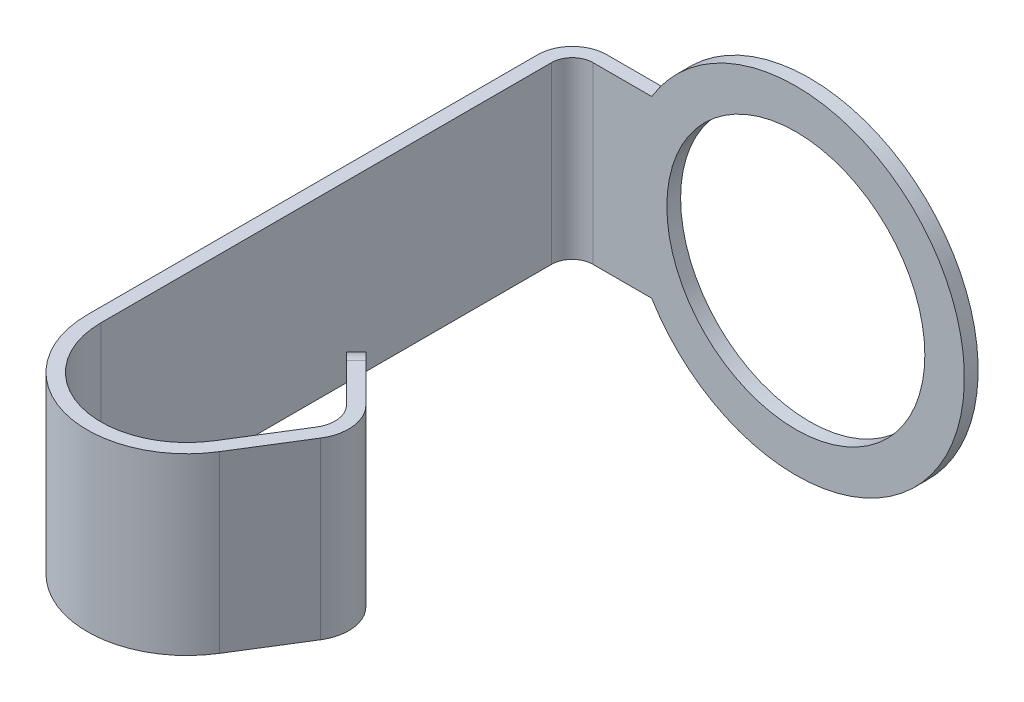
ISO-10303-21;
HEADER;
FILE_DESCRIPTION(('STEP AP214'),'2;1');
FILE_NAME('part.step','',(''),(''),'','','');
FILE_SCHEMA(('AUTOMOTIVE_DESIGN { 1 0 10303 214 1 1 1 1 }'));
ENDSEC;
DATA;
#1=APPLICATION_CONTEXT('core data for automotive mechanical design processes');
#2=APPLICATION_PROTOCOL_DEFINITION('international standard','automotive_design',2000,#1);
#3=PRODUCT_CONTEXT('',#1,'mechanical');
#4=PRODUCT('Part','Part','',(#3));
#5=PRODUCT_RELATED_PRODUCT_CATEGORY('part','',(#4));
#6=PRODUCT_DEFINITION_FORMATION('','',#4);
#7=PRODUCT_DEFINITION_CONTEXT('part definition',#1,'design');
#8=PRODUCT_DEFINITION('design','',#6,#7);
#9=PRODUCT_DEFINITION_SHAPE('','',#8);
#10=(LENGTH_UNIT() NAMED_UNIT(*) SI_UNIT(.MILLI.,.METRE.));
#11=(NAMED_UNIT(*) PLANE_ANGLE_UNIT() SI_UNIT($,.RADIAN.));
#12=(NAMED_UNIT(*) SI_UNIT($,.STERADIAN.) SOLID_ANGLE_UNIT());
#13=UNCERTAINTY_MEASURE_WITH_UNIT(LENGTH_MEASURE(1.E-05),#10,'distance_accuracy_value','');
#14=(GEOMETRIC_REPRESENTATION_CONTEXT(3) GLOBAL_UNCERTAINTY_ASSIGNED_CONTEXT((#13)) GLOBAL_UNIT_ASSIGNED_CONTEXT((#10,
#11,#12)) REPRESENTATION_CONTEXT('',''));
#15=CARTESIAN_POINT('',(0.,0.,0.));
#16=DIRECTION('',(0.,0.,1.));
#17=DIRECTION('',(1.,0.,0.));
#18=AXIS2_PLACEMENT_3D('',#15,#16,#17);
#19=CARTESIAN_POINT('',(0.,0.,0.508));
#20=DIRECTION('',(0.,0.,1.));
#21=DIRECTION('',(1.,0.,0.));
#22=AXIS2_PLACEMENT_3D('',#19,#20,#21);
#23=PLANE('',#22);
#24=CARTESIAN_POINT('',(0.,0.,0.508));
#25=DIRECTION('',(0.,0.,1.));
#26=DIRECTION('',(1.,0.,0.));
#27=AXIS2_PLACEMENT_3D('',#24,#25,#26);
#28=CIRCLE('',#27,6.223);
#29=CARTESIAN_POINT('',(-5.32164855660349,-3.2258,0.508));
#30=VERTEX_POINT('',#29);
#31=CARTESIAN_POINT('',(-5.32164855660349,3.2258,0.508));
#32=VERTEX_POINT('',#31);
#33=EDGE_CURVE('E286',#30,#32,#28,.T.);
#34=ORIENTED_EDGE('',*,*,#33,.T.);
#35=DIRECTION('',(1.,0.,0.));
#36=VECTOR('',#35,1.);
#37=CARTESIAN_POINT('',(-6.223,3.2258,0.508));
#38=LINE('',#37,#36);
#39=CARTESIAN_POINT('',(-7.49299999999999,3.2258,0.508));
#40=VERTEX_POINT('',#39);
#41=EDGE_CURVE('E170',#40,#32,#38,.T.);
#42=ORIENTED_EDGE('',*,*,#41,.F.);
#43=DIRECTION('',(0.,-1.,0.));
#44=VECTOR('',#43,1.);
#45=CARTESIAN_POINT('',(-7.49299999999999,3.2258,0.508));
#46=LINE('',#45,#44);
#47=CARTESIAN_POINT('',(-7.49299999999999,-3.2258,0.508));
#48=VERTEX_POINT('',#47);
#49=EDGE_CURVE('E242',#40,#48,#46,.T.);
#50=ORIENTED_EDGE('',*,*,#49,.T.);
#51=DIRECTION('',(-1.,0.,0.));
#52=VECTOR('',#51,1.);
#53=CARTESIAN_POINT('',(-5.32164855660349,-3.2258,0.508));
#54=LINE('',#53,#52);
#55=EDGE_CURVE('E272',#30,#48,#54,.T.);
#56=ORIENTED_EDGE('',*,*,#55,.F.);
#57=EDGE_LOOP('',(#34,#42,#50,#56));
#58=FACE_BOUND('',#57,.T.);
#59=CARTESIAN_POINT('',(0.,0.,0.508));
#60=DIRECTION('',(0.,0.,1.));
#61=DIRECTION('',(1.,0.,0.));
#62=AXIS2_PLACEMENT_3D('',#59,#60,#61);
#63=CIRCLE('',#62,4.7625);
#64=CARTESIAN_POINT('',(4.7625,0.,0.508));
#65=VERTEX_POINT('',#64);
#66=EDGE_CURVE('E281',#65,#65,#63,.T.);
#67=ORIENTED_EDGE('',*,*,#66,.F.);
#68=EDGE_LOOP('',(#67));
#69=FACE_BOUND('',#68,.T.);
#70=ADVANCED_FACE('F33',(#58,#69),#23,.T.);
#71=CARTESIAN_POINT('',(0.,0.,0.));
#72=DIRECTION('',(0.,0.,1.));
#73=DIRECTION('',(1.,0.,0.));
#74=AXIS2_PLACEMENT_3D('',#71,#72,#73);
#75=PLANE('',#74);
#76=CARTESIAN_POINT('',(0.,0.,0.));
#77=DIRECTION('',(0.,0.,1.));
#78=DIRECTION('',(1.,0.,0.));
#79=AXIS2_PLACEMENT_3D('',#76,#77,#78);
#80=CIRCLE('',#79,6.223);
#81=CARTESIAN_POINT('',(-5.32164855660349,-3.2258,0.));
#82=VERTEX_POINT('',#81);
#83=CARTESIAN_POINT('',(-5.32164855660349,3.2258,0.));
#84=VERTEX_POINT('',#83);
#85=EDGE_CURVE('E166',#82,#84,#80,.T.);
#86=ORIENTED_EDGE('',*,*,#85,.F.);
#87=DIRECTION('',(-1.,0.,0.));
#88=VECTOR('',#87,1.);
#89=CARTESIAN_POINT('',(-5.32164855660349,-3.2258,0.));
#90=LINE('',#89,#88);
#91=CARTESIAN_POINT('',(-7.49299999999999,-3.2258,0.));
#92=VERTEX_POINT('',#91);
#93=EDGE_CURVE('E159',#82,#92,#90,.T.);
#94=ORIENTED_EDGE('',*,*,#93,.T.);
#95=DIRECTION('',(0.,-1.,0.));
#96=VECTOR('',#95,1.);
#97=CARTESIAN_POINT('',(-7.49299999999999,3.2258,0.));
#98=LINE('',#97,#96);
#99=CARTESIAN_POINT('',(-7.49299999999999,3.2258,0.));
#100=VERTEX_POINT('',#99);
#101=EDGE_CURVE('E164',#100,#92,#98,.T.);
#102=ORIENTED_EDGE('',*,*,#101,.F.);
#103=DIRECTION('',(1.,0.,0.));
#104=VECTOR('',#103,1.);
#105=CARTESIAN_POINT('',(-6.223,3.2258,0.));
#106=LINE('',#105,#104);
#107=EDGE_CURVE('E171',#100,#84,#106,.T.);
#108=ORIENTED_EDGE('',*,*,#107,.T.);
#109=EDGE_LOOP('',(#86,#94,#102,#108));
#110=FACE_BOUND('',#109,.T.);
#111=CARTESIAN_POINT('',(0.,0.,0.));
#112=DIRECTION('',(0.,0.,1.));
#113=DIRECTION('',(1.,0.,0.));
#114=AXIS2_PLACEMENT_3D('',#111,#112,#113);
#115=CIRCLE('',#114,4.7625);
#116=CARTESIAN_POINT('',(4.7625,0.,0.));
#117=VERTEX_POINT('',#116);
#118=EDGE_CURVE('E278',#117,#117,#115,.T.);
#119=ORIENTED_EDGE('',*,*,#118,.T.);
#120=EDGE_LOOP('',(#119));
#121=FACE_BOUND('',#120,.T.);
#122=ADVANCED_FACE('F161',(#110,#121),#75,.F.);
#123=CARTESIAN_POINT('',(0.,0.,0.508));
#124=DIRECTION('',(0.,0.,-1.));
#125=DIRECTION('',(-1.,0.,0.));
#126=AXIS2_PLACEMENT_3D('',#123,#124,#125);
#127=CYLINDRICAL_SURFACE('',#126,6.223);
#128=ORIENTED_EDGE('',*,*,#33,.F.);
#129=DIRECTION('',(0.,0.,-1.));
#130=VECTOR('',#129,1.);
#131=CARTESIAN_POINT('',(-5.32164855660349,-3.2258,0.508));
#132=LINE('',#131,#130);
#133=EDGE_CURVE('E276',#30,#82,#132,.T.);
#134=ORIENTED_EDGE('',*,*,#133,.T.);
#135=ORIENTED_EDGE('',*,*,#85,.T.);
#136=DIRECTION('',(0.,0.,-1.));
#137=VECTOR('',#136,1.);
#138=CARTESIAN_POINT('',(-5.32164855660349,3.2258,0.508));
#139=LINE('',#138,#137);
#140=EDGE_CURVE('E274',#32,#84,#139,.T.);
#141=ORIENTED_EDGE('',*,*,#140,.F.);
#142=EDGE_LOOP('',(#128,#134,#135,#141));
#143=FACE_BOUND('',#142,.T.);
#144=ADVANCED_FACE('F351',(#143),#127,.T.);
#145=CARTESIAN_POINT('',(0.,0.,0.508));
#146=DIRECTION('',(0.,0.,-1.));
#147=DIRECTION('',(-1.,0.,0.));
#148=AXIS2_PLACEMENT_3D('',#145,#146,#147);
#149=CYLINDRICAL_SURFACE('',#148,4.7625);
#150=ORIENTED_EDGE('',*,*,#66,.T.);
#151=EDGE_LOOP('',(#150));
#152=FACE_BOUND('',#151,.T.);
#153=ORIENTED_EDGE('',*,*,#118,.F.);
#154=EDGE_LOOP('',(#153));
#155=FACE_BOUND('',#154,.T.);
#156=ADVANCED_FACE('F383',(#152,#155),#149,.F.);
#157=CARTESIAN_POINT('',(-5.32164855660349,-3.2258,0.508));
#158=DIRECTION('',(0.,-1.,0.));
#159=DIRECTION('',(1.,0.,0.));
#160=AXIS2_PLACEMENT_3D('',#157,#158,#159);
#161=PLANE('',#160);
#162=DIRECTION('',(0.707106781186549,0.,0.707106781186546));
#163=VECTOR('',#162,1.);
#164=CARTESIAN_POINT('',(-1.08772848389586,-3.2258,16.0136920057897));
#165=LINE('',#164,#163);
#166=CARTESIAN_POINT('',(-2.50918463273586,-3.2258,14.5922358569497));
#167=VERTEX_POINT('',#166);
#168=CARTESIAN_POINT('',(-1.08772848389586,-3.2258,16.0136920057897));
#169=VERTEX_POINT('',#168);
#170=EDGE_CURVE('E200',#167,#169,#165,.T.);
#171=ORIENTED_EDGE('',*,*,#170,.F.);
#172=DIRECTION('',(-0.707106781186549,0.,0.707106781186546));
#173=VECTOR('',#172,1.);
#174=CARTESIAN_POINT('',(-2.1499743878931,-3.2258,14.2330256121069));
#175=LINE('',#174,#173);
#176=CARTESIAN_POINT('',(-2.1499743878931,-3.2258,14.2330256121069));
#177=VERTEX_POINT('',#176);
#178=EDGE_CURVE('E11',#167,#177,#175,.F.);
#179=ORIENTED_EDGE('',*,*,#178,.T.);
#180=DIRECTION('',(-0.707106781186549,0.,-0.707106781186546));
#181=VECTOR('',#180,1.);
#182=CARTESIAN_POINT('',(-0.728518239053098,-3.2258,15.6544817609469));
#183=LINE('',#182,#181);
#184=CARTESIAN_POINT('',(-0.728518239053097,-3.2258,15.6544817609469));
#185=VERTEX_POINT('',#184);
#186=EDGE_CURVE('E198',#185,#177,#183,.T.);
#187=ORIENTED_EDGE('',*,*,#186,.F.);
#188=CARTESIAN_POINT('',(-1.80614897358139,-3.2258,16.7321124954752));
#189=DIRECTION('',(0.,1.,0.));
#190=DIRECTION('',(0.,0.,1.));
#191=AXIS2_PLACEMENT_3D('',#188,#189,#190);
#192=CIRCLE('',#191,1.524);
#193=CARTESIAN_POINT('',(-0.512193664691142,-3.2258,17.5372557489368));
#194=VERTEX_POINT('',#193);
#195=EDGE_CURVE('E195',#194,#185,#192,.T.);
#196=ORIENTED_EDGE('',*,*,#195,.F.);
#197=DIRECTION('',(0.528309221431496,0.,-0.849052039954234));
#198=VECTOR('',#197,1.);
#199=CARTESIAN_POINT('',(-0.512193664691142,-3.2258,17.5372557489368));
#200=LINE('',#199,#198);
#201=CARTESIAN_POINT('',(-1.94460824990761,-3.2258,19.8393062835515));
#202=VERTEX_POINT('',#201);
#203=EDGE_CURVE('E192',#202,#194,#200,.T.);
#204=ORIENTED_EDGE('',*,*,#203,.F.);
#205=CARTESIAN_POINT('',(-5.08,-3.2258,17.907));
#206=DIRECTION('',(0.,1.,0.));
#207=DIRECTION('',(0.,0.,1.));
#208=AXIS2_PLACEMENT_3D('',#205,#206,#207);
#209=CIRCLE('',#208,3.683);
#210=CARTESIAN_POINT('',(-8.763,-3.2258,17.907));
#211=VERTEX_POINT('',#210);
#212=EDGE_CURVE('E187',#211,#202,#209,.T.);
#213=ORIENTED_EDGE('',*,*,#212,.F.);
#214=DIRECTION('',(0.,0.,1.));
#215=VECTOR('',#214,1.);
#216=CARTESIAN_POINT('',(-8.763,-3.2258,1.27000000000001));
#217=LINE('',#216,#215);
#218=CARTESIAN_POINT('',(-8.763,-3.2258,1.27000000000001));
#219=VERTEX_POINT('',#218);
#220=EDGE_CURVE('E185',#219,#211,#217,.T.);
#221=ORIENTED_EDGE('',*,*,#220,.F.);
#222=CARTESIAN_POINT('',(-7.493,-3.2258,1.27));
#223=DIRECTION('',(0.,1.,0.));
#224=DIRECTION('',(0.,0.,-1.));
#225=AXIS2_PLACEMENT_3D('',#222,#223,#224);
#226=CIRCLE('',#225,1.27);
#227=EDGE_CURVE('E177',#92,#219,#226,.T.);
#228=ORIENTED_EDGE('',*,*,#227,.F.);
#229=ORIENTED_EDGE('',*,*,#93,.F.);
#230=ORIENTED_EDGE('',*,*,#133,.F.);
#231=ORIENTED_EDGE('',*,*,#55,.T.);
#232=CARTESIAN_POINT('',(-7.493,-3.2258,1.27));
#233=DIRECTION('',(0.,-1.,0.));
#234=DIRECTION('',(0.,0.,-1.));
#235=AXIS2_PLACEMENT_3D('',#232,#233,#234);
#236=CIRCLE('',#235,0.762);
#237=CARTESIAN_POINT('',(-8.255,-3.2258,1.27000000000001));
#238=VERTEX_POINT('',#237);
#239=EDGE_CURVE('E214',#238,#48,#236,.T.);
#240=ORIENTED_EDGE('',*,*,#239,.F.);
#241=DIRECTION('',(0.,0.,-1.));
#242=VECTOR('',#241,1.);
#243=CARTESIAN_POINT('',(-8.255,-3.2258,1.27000000000001));
#244=LINE('',#243,#242);
#245=CARTESIAN_POINT('',(-8.255,-3.2258,17.907));
#246=VERTEX_POINT('',#245);
#247=EDGE_CURVE('E211',#246,#238,#244,.T.);
#248=ORIENTED_EDGE('',*,*,#247,.F.);
#249=CARTESIAN_POINT('',(-5.08,-3.2258,17.907));
#250=DIRECTION('',(0.,-1.,0.));
#251=DIRECTION('',(0.,0.,1.));
#252=AXIS2_PLACEMENT_3D('',#249,#250,#251);
#253=CIRCLE('',#252,3.175);
#254=CARTESIAN_POINT('',(-2.37652476436898,-3.2258,19.5718863776035));
#255=VERTEX_POINT('',#254);
#256=EDGE_CURVE('E208',#255,#246,#253,.T.);
#257=ORIENTED_EDGE('',*,*,#256,.F.);
#258=DIRECTION('',(-0.528309221431496,0.,0.849052039954235));
#259=VECTOR('',#258,1.);
#260=CARTESIAN_POINT('',(-0.943512100987888,-3.2258,17.2688746644496));
#261=LINE('',#260,#259);
#262=CARTESIAN_POINT('',(-0.943512100987889,-3.2258,17.2688746644496));
#263=VERTEX_POINT('',#262);
#264=EDGE_CURVE('E205',#263,#255,#261,.T.);
#265=ORIENTED_EDGE('',*,*,#264,.F.);
#266=CARTESIAN_POINT('',(-1.80614897358139,-3.2258,16.7321124954752));
#267=DIRECTION('',(0.,-1.,0.));
#268=DIRECTION('',(0.,0.,1.));
#269=AXIS2_PLACEMENT_3D('',#266,#267,#268);
#270=CIRCLE('',#269,1.016);
#271=EDGE_CURVE('E202',#169,#263,#270,.T.);
#272=ORIENTED_EDGE('',*,*,#271,.F.);
#273=EDGE_LOOP('',(#171,#179,#187,#196,#204,#213,#221,#228,#229,#230,#231,#240,#248,#257,#265,#272));
#274=FACE_BOUND('',#273,.T.);
#275=ADVANCED_FACE('F182',(#274),#161,.T.);
#276=CARTESIAN_POINT('',(-6.223,3.2258,0.508));
#277=DIRECTION('',(0.,1.,0.));
#278=DIRECTION('',(0.,0.,1.));
#279=AXIS2_PLACEMENT_3D('',#276,#277,#278);
#280=PLANE('',#279);
#281=DIRECTION('',(-0.707106781186549,0.,-0.707106781186546));
#282=VECTOR('',#281,1.);
#283=CARTESIAN_POINT('',(-0.728518239053098,3.2258,15.6544817609469));
#284=LINE('',#283,#282);
#285=CARTESIAN_POINT('',(-0.728518239053097,3.2258,15.6544817609469));
#286=VERTEX_POINT('',#285);
#287=CARTESIAN_POINT('',(-2.14997438789309,3.2258,14.2330256121069));
#288=VERTEX_POINT('',#287);
#289=EDGE_CURVE('E226',#286,#288,#284,.T.);
#290=ORIENTED_EDGE('',*,*,#289,.T.);
#291=DIRECTION('',(-0.707106781186549,0.,0.707106781186546));
#292=VECTOR('',#291,1.);
#293=CARTESIAN_POINT('',(-2.50918463273586,3.2258,14.5922358569497));
#294=LINE('',#293,#292);
#295=CARTESIAN_POINT('',(-2.50918463273586,3.2258,14.5922358569497));
#296=VERTEX_POINT('',#295);
#297=EDGE_CURVE('E289',#288,#296,#294,.T.);
#298=ORIENTED_EDGE('',*,*,#297,.T.);
#299=DIRECTION('',(0.707106781186549,0.,0.707106781186546));
#300=VECTOR('',#299,1.);
#301=CARTESIAN_POINT('',(-1.08772848389586,3.2258,16.0136920057897));
#302=LINE('',#301,#300);
#303=CARTESIAN_POINT('',(-1.08772848389586,3.2258,16.0136920057897));
#304=VERTEX_POINT('',#303);
#305=EDGE_CURVE('E229',#296,#304,#302,.T.);
#306=ORIENTED_EDGE('',*,*,#305,.T.);
#307=CARTESIAN_POINT('',(-1.80614897358139,3.2258,16.7321124954752));
#308=DIRECTION('',(0.,-1.,0.));
#309=DIRECTION('',(0.,0.,1.));
#310=AXIS2_PLACEMENT_3D('',#307,#308,#309);
#311=CIRCLE('',#310,1.016);
#312=CARTESIAN_POINT('',(-0.943512100987889,3.2258,17.2688746644496));
#313=VERTEX_POINT('',#312);
#314=EDGE_CURVE('E231',#304,#313,#311,.T.);
#315=ORIENTED_EDGE('',*,*,#314,.T.);
#316=DIRECTION('',(-0.528309221431496,0.,0.849052039954235));
#317=VECTOR('',#316,1.);
#318=CARTESIAN_POINT('',(-0.943512100987888,3.2258,17.2688746644496));
#319=LINE('',#318,#317);
#320=CARTESIAN_POINT('',(-2.37652476436898,3.2258,19.5718863776035));
#321=VERTEX_POINT('',#320);
#322=EDGE_CURVE('E233',#313,#321,#319,.T.);
#323=ORIENTED_EDGE('',*,*,#322,.T.);
#324=CARTESIAN_POINT('',(-5.08,3.2258,17.907));
#325=DIRECTION('',(0.,-1.,0.));
#326=DIRECTION('',(0.,0.,1.));
#327=AXIS2_PLACEMENT_3D('',#324,#325,#326);
#328=CIRCLE('',#327,3.175);
#329=CARTESIAN_POINT('',(-8.255,3.2258,17.907));
#330=VERTEX_POINT('',#329);
#331=EDGE_CURVE('E235',#321,#330,#328,.T.);
#332=ORIENTED_EDGE('',*,*,#331,.T.);
#333=DIRECTION('',(0.,0.,-1.));
#334=VECTOR('',#333,1.);
#335=CARTESIAN_POINT('',(-8.255,3.2258,1.27000000000001));
#336=LINE('',#335,#334);
#337=CARTESIAN_POINT('',(-8.255,3.2258,1.27000000000001));
#338=VERTEX_POINT('',#337);
#339=EDGE_CURVE('E237',#330,#338,#336,.T.);
#340=ORIENTED_EDGE('',*,*,#339,.T.);
#341=CARTESIAN_POINT('',(-7.493,3.2258,1.27));
#342=DIRECTION('',(0.,-1.,0.));
#343=DIRECTION('',(0.,0.,-1.));
#344=AXIS2_PLACEMENT_3D('',#341,#342,#343);
#345=CIRCLE('',#344,0.762);
#346=EDGE_CURVE('E239',#338,#40,#345,.T.);
#347=ORIENTED_EDGE('',*,*,#346,.T.);
#348=ORIENTED_EDGE('',*,*,#41,.T.);
#349=ORIENTED_EDGE('',*,*,#140,.T.);
#350=ORIENTED_EDGE('',*,*,#107,.F.);
#351=CARTESIAN_POINT('',(-7.493,3.2258,1.27));
#352=DIRECTION('',(0.,1.,0.));
#353=DIRECTION('',(0.,0.,-1.));
#354=AXIS2_PLACEMENT_3D('',#351,#352,#353);
#355=CIRCLE('',#354,1.27);
#356=CARTESIAN_POINT('',(-8.763,3.2258,1.27000000000001));
#357=VERTEX_POINT('',#356);
#358=EDGE_CURVE('E178',#100,#357,#355,.T.);
#359=ORIENTED_EDGE('',*,*,#358,.T.);
#360=DIRECTION('',(0.,0.,1.));
#361=VECTOR('',#360,1.);
#362=CARTESIAN_POINT('',(-8.763,3.2258,1.27000000000001));
#363=LINE('',#362,#361);
#364=CARTESIAN_POINT('',(-8.763,3.2258,17.907));
#365=VERTEX_POINT('',#364);
#366=EDGE_CURVE('E218',#357,#365,#363,.T.);
#367=ORIENTED_EDGE('',*,*,#366,.T.);
#368=CARTESIAN_POINT('',(-5.08,3.2258,17.907));
#369=DIRECTION('',(0.,1.,0.));
#370=DIRECTION('',(0.,0.,1.));
#371=AXIS2_PLACEMENT_3D('',#368,#369,#370);
#372=CIRCLE('',#371,3.683);
#373=CARTESIAN_POINT('',(-1.94460824990761,3.2258,19.8393062835515));
#374=VERTEX_POINT('',#373);
#375=EDGE_CURVE('E220',#365,#374,#372,.T.);
#376=ORIENTED_EDGE('',*,*,#375,.T.);
#377=DIRECTION('',(0.528309221431496,0.,-0.849052039954234));
#378=VECTOR('',#377,1.);
#379=CARTESIAN_POINT('',(-0.512193664691142,3.2258,17.5372557489368));
#380=LINE('',#379,#378);
#381=CARTESIAN_POINT('',(-0.512193664691142,3.2258,17.5372557489368));
#382=VERTEX_POINT('',#381);
#383=EDGE_CURVE('E222',#374,#382,#380,.T.);
#384=ORIENTED_EDGE('',*,*,#383,.T.);
#385=CARTESIAN_POINT('',(-1.80614897358139,3.2258,16.7321124954752));
#386=DIRECTION('',(0.,1.,0.));
#387=DIRECTION('',(0.,0.,1.));
#388=AXIS2_PLACEMENT_3D('',#385,#386,#387);
#389=CIRCLE('',#388,1.524);
#390=EDGE_CURVE('E224',#382,#286,#389,.T.);
#391=ORIENTED_EDGE('',*,*,#390,.T.);
#392=EDGE_LOOP('',(#290,#298,#306,#315,#323,#332,#340,#347,#348,#349,#350,#359,#367,#376,#384,#391));
#393=FACE_BOUND('',#392,.T.);
#394=ADVANCED_FACE('F309',(#393),#280,.T.);
#395=CARTESIAN_POINT('',(-7.493,3.2258,1.27));
#396=DIRECTION('',(0.,-1.,0.));
#397=DIRECTION('',(0.,0.,-1.));
#398=AXIS2_PLACEMENT_3D('',#395,#396,#397);
#399=CYLINDRICAL_SURFACE('',#398,1.27);
#400=ORIENTED_EDGE('',*,*,#101,.T.);
#401=ORIENTED_EDGE('',*,*,#227,.T.);
#402=DIRECTION('',(0.,-1.,0.));
#403=VECTOR('',#402,1.);
#404=CARTESIAN_POINT('',(-8.763,3.2258,1.27000000000001));
#405=LINE('',#404,#403);
#406=EDGE_CURVE('E179',#357,#219,#405,.T.);
#407=ORIENTED_EDGE('',*,*,#406,.F.);
#408=ORIENTED_EDGE('',*,*,#358,.F.);
#409=EDGE_LOOP('',(#400,#401,#407,#408));
#410=FACE_BOUND('',#409,.T.);
#411=ADVANCED_FACE('F175',(#410),#399,.T.);
#412=CARTESIAN_POINT('',(-8.763,3.2258,1.27000000000001));
#413=DIRECTION('',(1.,0.,0.));
#414=DIRECTION('',(0.,0.,-1.));
#415=AXIS2_PLACEMENT_3D('',#412,#413,#414);
#416=PLANE('',#415);
#417=ORIENTED_EDGE('',*,*,#406,.T.);
#418=ORIENTED_EDGE('',*,*,#220,.T.);
#419=DIRECTION('',(0.,-1.,0.));
#420=VECTOR('',#419,1.);
#421=CARTESIAN_POINT('',(-8.763,3.2258,17.907));
#422=LINE('',#421,#420);
#423=EDGE_CURVE('E267',#365,#211,#422,.T.);
#424=ORIENTED_EDGE('',*,*,#423,.F.);
#425=ORIENTED_EDGE('',*,*,#366,.F.);
#426=EDGE_LOOP('',(#417,#418,#424,#425));
#427=FACE_BOUND('',#426,.T.);
#428=ADVANCED_FACE('F355',(#427),#416,.F.);
#429=CARTESIAN_POINT('',(-5.08,3.2258,17.907));
#430=DIRECTION('',(0.,-1.,0.));
#431=DIRECTION('',(0.,0.,-1.));
#432=AXIS2_PLACEMENT_3D('',#429,#430,#431);
#433=CYLINDRICAL_SURFACE('',#432,3.683);
#434=ORIENTED_EDGE('',*,*,#423,.T.);
#435=ORIENTED_EDGE('',*,*,#212,.T.);
#436=DIRECTION('',(0.,-1.,0.));
#437=VECTOR('',#436,1.);
#438=CARTESIAN_POINT('',(-1.94460824990761,3.2258,19.8393062835515));
#439=LINE('',#438,#437);
#440=EDGE_CURVE('E265',#374,#202,#439,.T.);
#441=ORIENTED_EDGE('',*,*,#440,.F.);
#442=ORIENTED_EDGE('',*,*,#375,.F.);
#443=EDGE_LOOP('',(#434,#435,#441,#442));
#444=FACE_BOUND('',#443,.T.);
#445=ADVANCED_FACE('F359',(#444),#433,.T.);
#446=CARTESIAN_POINT('',(-0.512193664691142,3.2258,17.5372557489368));
#447=DIRECTION('',(-0.849052039954234,0.,-0.528309221431496));
#448=DIRECTION('',(-0.528309221431496,0.,0.849052039954234));
#449=AXIS2_PLACEMENT_3D('',#446,#447,#448);
#450=PLANE('',#449);
#451=ORIENTED_EDGE('',*,*,#440,.T.);
#452=ORIENTED_EDGE('',*,*,#203,.T.);
#453=DIRECTION('',(0.,-1.,0.));
#454=VECTOR('',#453,1.);
#455=CARTESIAN_POINT('',(-0.512193664691142,3.2258,17.5372557489368));
#456=LINE('',#455,#454);
#457=EDGE_CURVE('E263',#382,#194,#456,.T.);
#458=ORIENTED_EDGE('',*,*,#457,.F.);
#459=ORIENTED_EDGE('',*,*,#383,.F.);
#460=EDGE_LOOP('',(#451,#452,#458,#459));
#461=FACE_BOUND('',#460,.T.);
#462=ADVANCED_FACE('F363',(#461),#450,.F.);
#463=CARTESIAN_POINT('',(-1.80614897358139,3.2258,16.7321124954752));
#464=DIRECTION('',(0.,-1.,0.));
#465=DIRECTION('',(0.,0.,-1.));
#466=AXIS2_PLACEMENT_3D('',#463,#464,#465);
#467=CYLINDRICAL_SURFACE('',#466,1.524);
#468=ORIENTED_EDGE('',*,*,#457,.T.);
#469=ORIENTED_EDGE('',*,*,#195,.T.);
#470=DIRECTION('',(0.,-1.,0.));
#471=VECTOR('',#470,1.);
#472=CARTESIAN_POINT('',(-0.728518239053097,3.2258,15.6544817609469));
#473=LINE('',#472,#471);
#474=EDGE_CURVE('E261',#286,#185,#473,.T.);
#475=ORIENTED_EDGE('',*,*,#474,.F.);
#476=ORIENTED_EDGE('',*,*,#390,.F.);
#477=EDGE_LOOP('',(#468,#469,#475,#476));
#478=FACE_BOUND('',#477,.T.);
#479=ADVANCED_FACE('F367',(#478),#467,.T.);
#480=CARTESIAN_POINT('',(-0.728518239053098,3.2258,15.6544817609469));
#481=DIRECTION('',(-0.707106781186546,0.,0.707106781186549));
#482=DIRECTION('',(0.707106781186549,0.,0.707106781186546));
#483=AXIS2_PLACEMENT_3D('',#480,#481,#482);
#484=PLANE('',#483);
#485=DIRECTION('',(0.,-1.,0.));
#486=VECTOR('',#485,1.);
#487=CARTESIAN_POINT('',(-3.04800000000001,3.2258,13.335));
#488=LINE('',#487,#486);
#489=CARTESIAN_POINT('',(-3.04800000000001,1.9558,13.335));
#490=VERTEX_POINT('',#489);
#491=CARTESIAN_POINT('',(-3.04800000000001,-1.9558,13.335));
#492=VERTEX_POINT('',#491);
#493=EDGE_CURVE('E259',#490,#492,#488,.T.);
#494=ORIENTED_EDGE('',*,*,#493,.F.);
#495=CARTESIAN_POINT('',(-2.14997438789309,1.9558,14.2330256121069));
#496=DIRECTION('',(-0.707106781186546,0.,0.707106781186549));
#497=DIRECTION('',(0.707106781186549,0.,0.707106781186546));
#498=AXIS2_PLACEMENT_3D('',#495,#496,#497);
#499=CIRCLE('',#498,1.27);
#500=EDGE_CURVE('E41',#490,#288,#499,.F.);
#501=ORIENTED_EDGE('',*,*,#500,.T.);
#502=ORIENTED_EDGE('',*,*,#289,.F.);
#503=ORIENTED_EDGE('',*,*,#474,.T.);
#504=ORIENTED_EDGE('',*,*,#186,.T.);
#505=CARTESIAN_POINT('',(-2.14997438789309,-1.9558,14.2330256121069));
#506=DIRECTION('',(-0.707106781186546,0.,0.707106781186549));
#507=DIRECTION('',(0.707106781186549,0.,0.707106781186546));
#508=AXIS2_PLACEMENT_3D('',#505,#506,#507);
#509=CIRCLE('',#508,1.27);
#510=EDGE_CURVE('E53',#177,#492,#509,.F.);
#511=ORIENTED_EDGE('',*,*,#510,.T.);
#512=EDGE_LOOP('',(#494,#501,#502,#503,#504,#511));
#513=FACE_BOUND('',#512,.T.);
#514=ADVANCED_FACE('F304',(#513),#484,.F.);
#515=CARTESIAN_POINT('',(-3.04800000000001,3.2258,13.335));
#516=DIRECTION('',(0.707106781186546,0.,0.707106781186549));
#517=DIRECTION('',(0.707106781186549,0.,-0.707106781186546));
#518=AXIS2_PLACEMENT_3D('',#515,#516,#517);
#519=PLANE('',#518);
#520=DIRECTION('',(0.,-1.,0.));
#521=VECTOR('',#520,1.);
#522=CARTESIAN_POINT('',(-3.40721024484278,3.2258,13.6942102448428));
#523=LINE('',#522,#521);
#524=CARTESIAN_POINT('',(-3.40721024484278,1.9558,13.6942102448428));
#525=VERTEX_POINT('',#524);
#526=CARTESIAN_POINT('',(-3.40721024484278,-1.9558,13.6942102448428));
#527=VERTEX_POINT('',#526);
#528=EDGE_CURVE('E256',#525,#527,#523,.T.);
#529=ORIENTED_EDGE('',*,*,#528,.F.);
#530=DIRECTION('',(-0.707106781186549,0.,0.707106781186546));
#531=VECTOR('',#530,1.);
#532=CARTESIAN_POINT('',(-3.04800000000001,1.9558,13.335));
#533=LINE('',#532,#531);
#534=EDGE_CURVE('E300',#525,#490,#533,.F.);
#535=ORIENTED_EDGE('',*,*,#534,.T.);
#536=ORIENTED_EDGE('',*,*,#493,.T.);
#537=DIRECTION('',(-0.707106781186549,0.,0.707106781186546));
#538=VECTOR('',#537,1.);
#539=CARTESIAN_POINT('',(-3.40721024484278,-1.9558,13.6942102448428));
#540=LINE('',#539,#538);
#541=EDGE_CURVE('E297',#492,#527,#540,.T.);
#542=ORIENTED_EDGE('',*,*,#541,.T.);
#543=EDGE_LOOP('',(#529,#535,#536,#542));
#544=FACE_BOUND('',#543,.T.);
#545=ADVANCED_FACE('F319',(#544),#519,.F.);
#546=CARTESIAN_POINT('',(-1.08772848389586,3.2258,16.0136920057897));
#547=DIRECTION('',(0.707106781186546,0.,-0.707106781186549));
#548=DIRECTION('',(-0.707106781186549,0.,-0.707106781186546));
#549=AXIS2_PLACEMENT_3D('',#546,#547,#548);
#550=PLANE('',#549);
#551=ORIENTED_EDGE('',*,*,#305,.F.);
#552=CARTESIAN_POINT('',(-2.50918463273586,1.9558,14.5922358569497));
#553=DIRECTION('',(0.707106781186546,0.,-0.707106781186549));
#554=DIRECTION('',(-0.707106781186549,0.,-0.707106781186546));
#555=AXIS2_PLACEMENT_3D('',#552,#553,#554);
#556=CIRCLE('',#555,1.27);
#557=EDGE_CURVE('E295',#296,#525,#556,.F.);
#558=ORIENTED_EDGE('',*,*,#557,.T.);
#559=ORIENTED_EDGE('',*,*,#528,.T.);
#560=CARTESIAN_POINT('',(-2.50918463273586,-1.9558,14.5922358569497));
#561=DIRECTION('',(0.707106781186546,0.,-0.707106781186549));
#562=DIRECTION('',(-0.707106781186549,0.,-0.707106781186546));
#563=AXIS2_PLACEMENT_3D('',#560,#561,#562);
#564=CIRCLE('',#563,1.27);
#565=EDGE_CURVE('E293',#527,#167,#564,.F.);
#566=ORIENTED_EDGE('',*,*,#565,.T.);
#567=ORIENTED_EDGE('',*,*,#170,.T.);
#568=DIRECTION('',(0.,-1.,0.));
#569=VECTOR('',#568,1.);
#570=CARTESIAN_POINT('',(-1.08772848389586,3.2258,16.0136920057897));
#571=LINE('',#570,#569);
#572=EDGE_CURVE('E253',#304,#169,#571,.T.);
#573=ORIENTED_EDGE('',*,*,#572,.F.);
#574=EDGE_LOOP('',(#551,#558,#559,#566,#567,#573));
#575=FACE_BOUND('',#574,.T.);
#576=ADVANCED_FACE('F316',(#575),#550,.F.);
#577=CARTESIAN_POINT('',(-1.80614897358139,3.2258,16.7321124954752));
#578=DIRECTION('',(0.,-1.,0.));
#579=DIRECTION('',(0.,0.,-1.));
#580=AXIS2_PLACEMENT_3D('',#577,#578,#579);
#581=CYLINDRICAL_SURFACE('',#580,1.016);
#582=ORIENTED_EDGE('',*,*,#572,.T.);
#583=ORIENTED_EDGE('',*,*,#271,.T.);
#584=DIRECTION('',(0.,-1.,0.));
#585=VECTOR('',#584,1.);
#586=CARTESIAN_POINT('',(-0.943512100987889,3.2258,17.2688746644496));
#587=LINE('',#586,#585);
#588=EDGE_CURVE('E251',#313,#263,#587,.T.);
#589=ORIENTED_EDGE('',*,*,#588,.F.);
#590=ORIENTED_EDGE('',*,*,#314,.F.);
#591=EDGE_LOOP('',(#582,#583,#589,#590));
#592=FACE_BOUND('',#591,.T.);
#593=ADVANCED_FACE('F327',(#592),#581,.F.);
#594=CARTESIAN_POINT('',(-0.943512100987888,3.2258,17.2688746644496));
#595=DIRECTION('',(0.849052039954234,0.,0.528309221431496));
#596=DIRECTION('',(0.528309221431496,0.,-0.849052039954235));
#597=AXIS2_PLACEMENT_3D('',#594,#595,#596);
#598=PLANE('',#597);
#599=ORIENTED_EDGE('',*,*,#588,.T.);
#600=ORIENTED_EDGE('',*,*,#264,.T.);
#601=DIRECTION('',(0.,-1.,0.));
#602=VECTOR('',#601,1.);
#603=CARTESIAN_POINT('',(-2.37652476436898,3.2258,19.5718863776035));
#604=LINE('',#603,#602);
#605=EDGE_CURVE('E249',#321,#255,#604,.T.);
#606=ORIENTED_EDGE('',*,*,#605,.F.);
#607=ORIENTED_EDGE('',*,*,#322,.F.);
#608=EDGE_LOOP('',(#599,#600,#606,#607));
#609=FACE_BOUND('',#608,.T.);
#610=ADVANCED_FACE('F334',(#609),#598,.F.);
#611=CARTESIAN_POINT('',(-5.08,3.2258,17.907));
#612=DIRECTION('',(0.,-1.,0.));
#613=DIRECTION('',(0.,0.,-1.));
#614=AXIS2_PLACEMENT_3D('',#611,#612,#613);
#615=CYLINDRICAL_SURFACE('',#614,3.175);
#616=ORIENTED_EDGE('',*,*,#605,.T.);
#617=ORIENTED_EDGE('',*,*,#256,.T.);
#618=DIRECTION('',(0.,-1.,0.));
#619=VECTOR('',#618,1.);
#620=CARTESIAN_POINT('',(-8.255,3.2258,17.907));
#621=LINE('',#620,#619);
#622=EDGE_CURVE('E247',#330,#246,#621,.T.);
#623=ORIENTED_EDGE('',*,*,#622,.F.);
#624=ORIENTED_EDGE('',*,*,#331,.F.);
#625=EDGE_LOOP('',(#616,#617,#623,#624));
#626=FACE_BOUND('',#625,.T.);
#627=ADVANCED_FACE('F336',(#626),#615,.F.);
#628=CARTESIAN_POINT('',(-8.255,3.2258,1.27000000000001));
#629=DIRECTION('',(-1.,0.,0.));
#630=DIRECTION('',(0.,0.,1.));
#631=AXIS2_PLACEMENT_3D('',#628,#629,#630);
#632=PLANE('',#631);
#633=ORIENTED_EDGE('',*,*,#622,.T.);
#634=ORIENTED_EDGE('',*,*,#247,.T.);
#635=DIRECTION('',(0.,-1.,0.));
#636=VECTOR('',#635,1.);
#637=CARTESIAN_POINT('',(-8.255,3.2258,1.27000000000001));
#638=LINE('',#637,#636);
#639=EDGE_CURVE('E245',#338,#238,#638,.T.);
#640=ORIENTED_EDGE('',*,*,#639,.F.);
#641=ORIENTED_EDGE('',*,*,#339,.F.);
#642=EDGE_LOOP('',(#633,#634,#640,#641));
#643=FACE_BOUND('',#642,.T.);
#644=ADVANCED_FACE('F341',(#643),#632,.F.);
#645=CARTESIAN_POINT('',(-7.493,3.2258,1.27));
#646=DIRECTION('',(0.,-1.,0.));
#647=DIRECTION('',(0.,0.,-1.));
#648=AXIS2_PLACEMENT_3D('',#645,#646,#647);
#649=CYLINDRICAL_SURFACE('',#648,0.762);
#650=ORIENTED_EDGE('',*,*,#639,.T.);
#651=ORIENTED_EDGE('',*,*,#239,.T.);
#652=ORIENTED_EDGE('',*,*,#49,.F.);
#653=ORIENTED_EDGE('',*,*,#346,.F.);
#654=EDGE_LOOP('',(#650,#651,#652,#653));
#655=FACE_BOUND('',#654,.T.);
#656=ADVANCED_FACE('F345',(#655),#649,.F.);
#657=CARTESIAN_POINT('',(2.6760256121069,1.9558,9.40702561210694));
#658=DIRECTION('',(0.707106781186549,0.,-0.707106781186546));
#659=DIRECTION('',(-0.707106781186546,0.,-0.707106781186549));
#660=AXIS2_PLACEMENT_3D('',#657,#658,#659);
#661=CYLINDRICAL_SURFACE('',#660,1.27);
#662=ORIENTED_EDGE('',*,*,#500,.F.);
#663=ORIENTED_EDGE('',*,*,#534,.F.);
#664=ORIENTED_EDGE('',*,*,#557,.F.);
#665=ORIENTED_EDGE('',*,*,#297,.F.);
#666=EDGE_LOOP('',(#662,#663,#664,#665));
#667=FACE_BOUND('',#666,.T.);
#668=ADVANCED_FACE('F313',(#667),#661,.T.);
#669=CARTESIAN_POINT('',(-2.1499743878931,-1.9558,14.2330256121069));
#670=DIRECTION('',(0.707106781186549,0.,-0.707106781186546));
#671=DIRECTION('',(-0.707106781186546,0.,-0.707106781186549));
#672=AXIS2_PLACEMENT_3D('',#669,#670,#671);
#673=CYLINDRICAL_SURFACE('',#672,1.27);
#674=ORIENTED_EDGE('',*,*,#510,.F.);
#675=ORIENTED_EDGE('',*,*,#178,.F.);
#676=ORIENTED_EDGE('',*,*,#565,.F.);
#677=ORIENTED_EDGE('',*,*,#541,.F.);
#678=EDGE_LOOP('',(#674,#675,#676,#677));
#679=FACE_BOUND('',#678,.T.);
#680=ADVANCED_FACE('F35',(#679),#673,.T.);
#681=CLOSED_SHELL('',(#70,#122,#144,#156,#275,#394,#411,#428,#445,#462,#479,#514,#545,#576,#593,
#610,#627,#644,#656,#668,#680));
#682=MANIFOLD_SOLID_BREP('B2',#681);
#683=ADVANCED_BREP_SHAPE_REPRESENTATION('',(#18,#682),#14);
#684=SHAPE_DEFINITION_REPRESENTATION(#9,#683);
ENDSEC;
END-ISO-10303-21;
